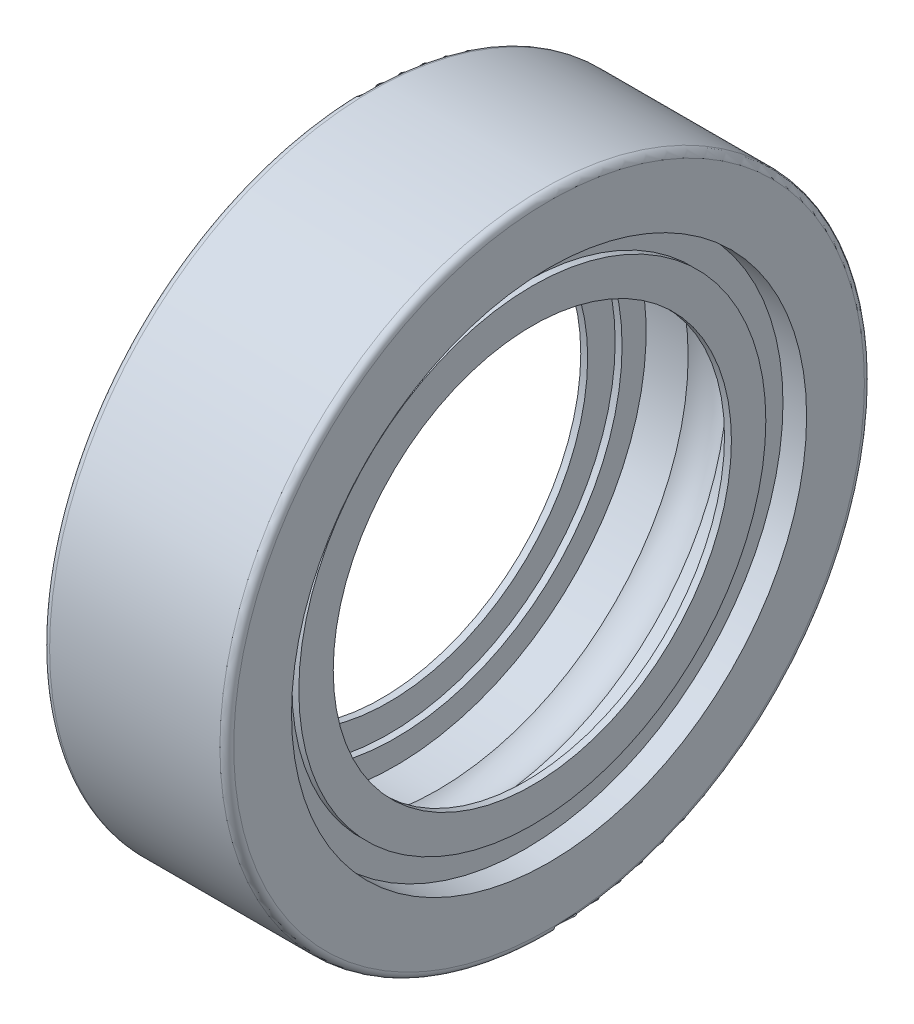
ISO-10303-21;
HEADER;
FILE_DESCRIPTION(('STEP AP214'),'2;1');
FILE_NAME('part.step','',(''),(''),'','','');
FILE_SCHEMA(('AUTOMOTIVE_DESIGN { 1 0 10303 214 1 1 1 1 }'));
ENDSEC;
DATA;
#1=APPLICATION_CONTEXT('core data for automotive mechanical design processes');
#2=APPLICATION_PROTOCOL_DEFINITION('international standard','automotive_design',2000,#1);
#3=PRODUCT_CONTEXT('',#1,'mechanical');
#4=PRODUCT('Part','Part','',(#3));
#5=PRODUCT_RELATED_PRODUCT_CATEGORY('part','',(#4));
#6=PRODUCT_DEFINITION_FORMATION('','',#4);
#7=PRODUCT_DEFINITION_CONTEXT('part definition',#1,'design');
#8=PRODUCT_DEFINITION('design','',#6,#7);
#9=PRODUCT_DEFINITION_SHAPE('','',#8);
#10=(LENGTH_UNIT() NAMED_UNIT(*) SI_UNIT(.MILLI.,.METRE.));
#11=(NAMED_UNIT(*) PLANE_ANGLE_UNIT() SI_UNIT($,.RADIAN.));
#12=(NAMED_UNIT(*) SI_UNIT($,.STERADIAN.) SOLID_ANGLE_UNIT());
#13=UNCERTAINTY_MEASURE_WITH_UNIT(LENGTH_MEASURE(1.E-05),#10,'distance_accuracy_value','');
#14=(GEOMETRIC_REPRESENTATION_CONTEXT(3) GLOBAL_UNCERTAINTY_ASSIGNED_CONTEXT((#13)) GLOBAL_UNIT_ASSIGNED_CONTEXT((#10,
#11,#12)) REPRESENTATION_CONTEXT('',''));
#15=CARTESIAN_POINT('',(0.,0.,0.));
#16=DIRECTION('',(0.,0.,1.));
#17=DIRECTION('',(1.,0.,0.));
#18=AXIS2_PLACEMENT_3D('',#15,#16,#17);
#19=CARTESIAN_POINT('',(3.9725,0.,9.2475));
#20=DIRECTION('',(-1.,0.,0.));
#21=DIRECTION('',(0.,0.,1.));
#22=AXIS2_PLACEMENT_3D('',#19,#20,#21);
#23=PLANE('',#22);
#24=CARTESIAN_POINT('',(3.9725,0.,0.));
#25=DIRECTION('',(1.,0.,0.));
#26=DIRECTION('',(0.,0.,-1.));
#27=AXIS2_PLACEMENT_3D('',#24,#25,#26);
#28=CIRCLE('',#27,8.65);
#29=CARTESIAN_POINT('',(3.9725,0.,-8.65));
#30=VERTEX_POINT('',#29);
#31=EDGE_CURVE('E203',#30,#30,#28,.T.);
#32=ORIENTED_EDGE('',*,*,#31,.T.);
#33=EDGE_LOOP('',(#32));
#34=FACE_BOUND('',#33,.T.);
#35=CARTESIAN_POINT('',(3.9725,0.,0.));
#36=DIRECTION('',(-1.,0.,0.));
#37=DIRECTION('',(0.,0.,-1.));
#38=AXIS2_PLACEMENT_3D('',#35,#36,#37);
#39=CIRCLE('',#38,9.845);
#40=CARTESIAN_POINT('',(3.9725,0.,-9.845));
#41=VERTEX_POINT('',#40);
#42=EDGE_CURVE('E11',#41,#41,#39,.T.);
#43=ORIENTED_EDGE('',*,*,#42,.T.);
#44=EDGE_LOOP('',(#43));
#45=FACE_BOUND('',#44,.T.);
#46=ADVANCED_FACE('F17',(#34,#45),#23,.T.);
#47=CARTESIAN_POINT('',(3.8225,0.,0.));
#48=DIRECTION('',(1.,0.,0.));
#49=DIRECTION('',(0.,0.,1.));
#50=AXIS2_PLACEMENT_3D('',#47,#48,#49);
#51=CYLINDRICAL_SURFACE('',#50,9.845);
#52=CARTESIAN_POINT('',(3.6725,0.,0.));
#53=DIRECTION('',(1.,0.,0.));
#54=DIRECTION('',(0.,0.,-1.));
#55=AXIS2_PLACEMENT_3D('',#52,#53,#54);
#56=CIRCLE('',#55,9.845);
#57=CARTESIAN_POINT('',(3.6725,0.,-9.845));
#58=VERTEX_POINT('',#57);
#59=EDGE_CURVE('E164',#58,#58,#56,.T.);
#60=ORIENTED_EDGE('',*,*,#59,.F.);
#61=DIRECTION('',(1.,0.,0.));
#62=VECTOR('',#61,1.);
#63=CARTESIAN_POINT('',(3.8225,0.,-9.845));
#64=LINE('',#63,#62);
#65=EDGE_CURVE('E28',#58,#41,#64,.T.);
#66=ORIENTED_EDGE('',*,*,#65,.T.);
#67=ORIENTED_EDGE('',*,*,#42,.F.);
#68=ORIENTED_EDGE('',*,*,#65,.F.);
#69=EDGE_LOOP('',(#60,#66,#67,#68));
#70=FACE_BOUND('',#69,.T.);
#71=ADVANCED_FACE('F643',(#70),#51,.F.);
#72=CARTESIAN_POINT('',(3.6725,0.,10.5175));
#73=DIRECTION('',(-1.,0.,0.));
#74=DIRECTION('',(0.,0.,1.));
#75=AXIS2_PLACEMENT_3D('',#72,#73,#74);
#76=PLANE('',#75);
#77=ORIENTED_EDGE('',*,*,#59,.T.);
#78=EDGE_LOOP('',(#77));
#79=FACE_BOUND('',#78,.T.);
#80=CARTESIAN_POINT('',(3.6725,0.,0.));
#81=DIRECTION('',(-1.,0.,0.));
#82=DIRECTION('',(0.,0.,1.));
#83=AXIS2_PLACEMENT_3D('',#80,#81,#82);
#84=CIRCLE('',#83,10.89);
#85=CARTESIAN_POINT('',(3.6725,0.,10.89));
#86=VERTEX_POINT('',#85);
#87=EDGE_CURVE('E159',#86,#86,#84,.T.);
#88=ORIENTED_EDGE('',*,*,#87,.T.);
#89=EDGE_LOOP('',(#88));
#90=FACE_BOUND('',#89,.T.);
#91=ADVANCED_FACE('F167',(#79,#90),#76,.T.);
#92=CARTESIAN_POINT('',(2.7596292626,0.,0.));
#93=DIRECTION('',(-1.,0.,0.));
#94=DIRECTION('',(0.,0.,-1.));
#95=AXIS2_PLACEMENT_3D('',#92,#93,#94);
#96=CYLINDRICAL_SURFACE('',#95,10.89);
#97=ORIENTED_EDGE('',*,*,#87,.F.);
#98=DIRECTION('',(-1.,0.,0.));
#99=VECTOR('',#98,1.);
#100=CARTESIAN_POINT('',(2.7596292626,0.,10.89));
#101=LINE('',#100,#99);
#102=CARTESIAN_POINT('',(1.846758525201,0.,10.89));
#103=VERTEX_POINT('',#102);
#104=EDGE_CURVE('E156',#86,#103,#101,.T.);
#105=ORIENTED_EDGE('',*,*,#104,.T.);
#106=CARTESIAN_POINT('',(1.846758525201,0.,0.));
#107=DIRECTION('',(1.,0.,0.));
#108=DIRECTION('',(0.,0.,1.));
#109=AXIS2_PLACEMENT_3D('',#106,#107,#108);
#110=CIRCLE('',#109,10.89);
#111=CARTESIAN_POINT('',(1.846758525201,0.,-10.89));
#112=VERTEX_POINT('',#111);
#113=EDGE_CURVE('E174',#112,#103,#110,.T.);
#114=ORIENTED_EDGE('',*,*,#113,.F.);
#115=CARTESIAN_POINT('',(1.846758525201,0.,0.));
#116=DIRECTION('',(1.,0.,0.));
#117=DIRECTION('',(0.,0.,1.));
#118=AXIS2_PLACEMENT_3D('',#115,#116,#117);
#119=CIRCLE('',#118,10.89);
#120=EDGE_CURVE('E161',#103,#112,#119,.T.);
#121=ORIENTED_EDGE('',*,*,#120,.F.);
#122=ORIENTED_EDGE('',*,*,#104,.F.);
#123=EDGE_LOOP('',(#97,#105,#114,#121,#122));
#124=FACE_BOUND('',#123,.T.);
#125=ADVANCED_FACE('F158',(#124),#96,.F.);
#126=CARTESIAN_POINT('',(1.,0.,0.));
#127=DIRECTION('',(1.,0.,0.));
#128=DIRECTION('',(0.,0.,1.));
#129=AXIS2_PLACEMENT_3D('',#126,#127,#128);
#130=TOROIDAL_SURFACE('',#129,9.845,1.345);
#131=CARTESIAN_POINT('',(0.1532414747993,0.,0.));
#132=DIRECTION('',(-1.,0.,0.));
#133=DIRECTION('',(0.,0.,1.));
#134=AXIS2_PLACEMENT_3D('',#131,#132,#133);
#135=CIRCLE('',#134,10.89);
#136=CARTESIAN_POINT('',(0.1532414747993,0.,10.89));
#137=VERTEX_POINT('',#136);
#138=CARTESIAN_POINT('',(0.1532414747993,0.,-10.89));
#139=VERTEX_POINT('',#138);
#140=EDGE_CURVE('E197',#137,#139,#135,.T.);
#141=ORIENTED_EDGE('',*,*,#140,.T.);
#142=CARTESIAN_POINT('',(1.,0.,-9.845));
#143=DIRECTION('',(0.,-1.,0.));
#144=DIRECTION('',(0.,0.,-1.));
#145=AXIS2_PLACEMENT_3D('',#142,#143,#144);
#146=CIRCLE('',#145,1.345);
#147=EDGE_CURVE('E204',#139,#112,#146,.T.);
#148=ORIENTED_EDGE('',*,*,#147,.T.);
#149=ORIENTED_EDGE('',*,*,#113,.T.);
#150=ORIENTED_EDGE('',*,*,#120,.T.);
#151=ORIENTED_EDGE('',*,*,#147,.F.);
#152=CARTESIAN_POINT('',(0.1532414747993,0.,0.));
#153=DIRECTION('',(-1.,0.,0.));
#154=DIRECTION('',(0.,0.,1.));
#155=AXIS2_PLACEMENT_3D('',#152,#153,#154);
#156=CIRCLE('',#155,10.89);
#157=EDGE_CURVE('E196',#139,#137,#156,.T.);
#158=ORIENTED_EDGE('',*,*,#157,.T.);
#159=EDGE_LOOP('',(#141,#148,#149,#150,#151,#158));
#160=FACE_BOUND('',#159,.T.);
#161=ADVANCED_FACE('F616',(#160),#130,.F.);
#162=CARTESIAN_POINT('',(-0.7596292626003,0.,0.));
#163=DIRECTION('',(-1.,0.,0.));
#164=DIRECTION('',(0.,0.,-1.));
#165=AXIS2_PLACEMENT_3D('',#162,#163,#164);
#166=CYLINDRICAL_SURFACE('',#165,10.89);
#167=ORIENTED_EDGE('',*,*,#140,.F.);
#168=DIRECTION('',(-1.,0.,0.));
#169=VECTOR('',#168,1.);
#170=CARTESIAN_POINT('',(-0.7596292626003,0.,10.89));
#171=LINE('',#170,#169);
#172=CARTESIAN_POINT('',(-1.6725,0.,10.89));
#173=VERTEX_POINT('',#172);
#174=EDGE_CURVE('E193',#137,#173,#171,.T.);
#175=ORIENTED_EDGE('',*,*,#174,.T.);
#176=CARTESIAN_POINT('',(-1.6725,0.,0.));
#177=DIRECTION('',(1.,0.,0.));
#178=DIRECTION('',(0.,0.,-1.));
#179=AXIS2_PLACEMENT_3D('',#176,#177,#178);
#180=CIRCLE('',#179,10.89);
#181=EDGE_CURVE('E389',#173,#173,#180,.T.);
#182=ORIENTED_EDGE('',*,*,#181,.F.);
#183=ORIENTED_EDGE('',*,*,#174,.F.);
#184=ORIENTED_EDGE('',*,*,#157,.F.);
#185=EDGE_LOOP('',(#167,#175,#182,#183,#184));
#186=FACE_BOUND('',#185,.T.);
#187=ADVANCED_FACE('F606',(#186),#166,.F.);
#188=CARTESIAN_POINT('',(-1.6725,0.,10.5175));
#189=DIRECTION('',(1.,0.,0.));
#190=DIRECTION('',(0.,1.,0.));
#191=AXIS2_PLACEMENT_3D('',#188,#189,#190);
#192=PLANE('',#191);
#193=CARTESIAN_POINT('',(-1.6725,0.,0.));
#194=DIRECTION('',(-1.,0.,0.));
#195=DIRECTION('',(0.,0.,-1.));
#196=AXIS2_PLACEMENT_3D('',#193,#194,#195);
#197=CIRCLE('',#196,9.845);
#198=CARTESIAN_POINT('',(-1.6725,0.,-9.845));
#199=VERTEX_POINT('',#198);
#200=EDGE_CURVE('E179',#199,#199,#197,.T.);
#201=ORIENTED_EDGE('',*,*,#200,.T.);
#202=EDGE_LOOP('',(#201));
#203=FACE_BOUND('',#202,.T.);
#204=ORIENTED_EDGE('',*,*,#181,.T.);
#205=EDGE_LOOP('',(#204));
#206=FACE_BOUND('',#205,.T.);
#207=ADVANCED_FACE('F19',(#203,#206),#192,.T.);
#208=CARTESIAN_POINT('',(-1.8225,0.,0.));
#209=DIRECTION('',(-1.,0.,0.));
#210=DIRECTION('',(0.,0.,1.));
#211=AXIS2_PLACEMENT_3D('',#208,#209,#210);
#212=CYLINDRICAL_SURFACE('',#211,9.845);
#213=ORIENTED_EDGE('',*,*,#200,.F.);
#214=DIRECTION('',(-1.,0.,0.));
#215=VECTOR('',#214,1.);
#216=CARTESIAN_POINT('',(-1.8225,0.,-9.845));
#217=LINE('',#216,#215);
#218=CARTESIAN_POINT('',(-1.9725,0.,-9.845));
#219=VERTEX_POINT('',#218);
#220=EDGE_CURVE('E183',#199,#219,#217,.T.);
#221=ORIENTED_EDGE('',*,*,#220,.T.);
#222=CARTESIAN_POINT('',(-1.9725,0.,0.));
#223=DIRECTION('',(1.,0.,0.));
#224=DIRECTION('',(0.,0.,1.));
#225=AXIS2_PLACEMENT_3D('',#222,#223,#224);
#226=CIRCLE('',#225,9.845);
#227=EDGE_CURVE('E184',#219,#219,#226,.T.);
#228=ORIENTED_EDGE('',*,*,#227,.F.);
#229=ORIENTED_EDGE('',*,*,#220,.F.);
#230=EDGE_LOOP('',(#213,#221,#228,#229));
#231=FACE_BOUND('',#230,.T.);
#232=ADVANCED_FACE('F588',(#231),#212,.F.);
#233=CARTESIAN_POINT('',(-1.9725,0.,9.2475));
#234=DIRECTION('',(1.,0.,0.));
#235=DIRECTION('',(0.,1.,0.));
#236=AXIS2_PLACEMENT_3D('',#233,#234,#235);
#237=PLANE('',#236);
#238=CARTESIAN_POINT('',(-1.9725,0.,0.));
#239=DIRECTION('',(-1.,0.,0.));
#240=DIRECTION('',(0.,0.,-1.));
#241=AXIS2_PLACEMENT_3D('',#238,#239,#240);
#242=CIRCLE('',#241,8.65);
#243=CARTESIAN_POINT('',(-1.9725,0.,-8.65));
#244=VERTEX_POINT('',#243);
#245=EDGE_CURVE('E21',#244,#244,#242,.T.);
#246=ORIENTED_EDGE('',*,*,#245,.T.);
#247=EDGE_LOOP('',(#246));
#248=FACE_BOUND('',#247,.T.);
#249=ORIENTED_EDGE('',*,*,#227,.T.);
#250=EDGE_LOOP('',(#249));
#251=FACE_BOUND('',#250,.T.);
#252=ADVANCED_FACE('F578',(#248,#251),#237,.T.);
#253=CARTESIAN_POINT('',(-2.1225,0.,0.));
#254=DIRECTION('',(-1.,0.,0.));
#255=DIRECTION('',(0.,0.,1.));
#256=AXIS2_PLACEMENT_3D('',#253,#254,#255);
#257=CYLINDRICAL_SURFACE('',#256,8.65);
#258=ORIENTED_EDGE('',*,*,#245,.F.);
#259=DIRECTION('',(-1.,0.,0.));
#260=VECTOR('',#259,1.);
#261=CARTESIAN_POINT('',(-2.1225,0.,-8.65));
#262=LINE('',#261,#260);
#263=CARTESIAN_POINT('',(-2.2725,0.,-8.65));
#264=VERTEX_POINT('',#263);
#265=EDGE_CURVE('E221',#244,#264,#262,.T.);
#266=ORIENTED_EDGE('',*,*,#265,.T.);
#267=CARTESIAN_POINT('',(-2.2725,0.,0.));
#268=DIRECTION('',(1.,0.,0.));
#269=DIRECTION('',(0.,0.,1.));
#270=AXIS2_PLACEMENT_3D('',#267,#268,#269);
#271=CIRCLE('',#270,8.65);
#272=EDGE_CURVE('E234',#264,#264,#271,.T.);
#273=ORIENTED_EDGE('',*,*,#272,.F.);
#274=ORIENTED_EDGE('',*,*,#265,.F.);
#275=EDGE_LOOP('',(#258,#266,#273,#274));
#276=FACE_BOUND('',#275,.T.);
#277=ADVANCED_FACE('F569',(#276),#257,.F.);
#278=CARTESIAN_POINT('',(-2.2725,0.,9.3975));
#279=DIRECTION('',(-1.,0.,0.));
#280=DIRECTION('',(0.,0.,1.));
#281=AXIS2_PLACEMENT_3D('',#278,#279,#280);
#282=PLANE('',#281);
#283=ORIENTED_EDGE('',*,*,#272,.T.);
#284=EDGE_LOOP('',(#283));
#285=FACE_BOUND('',#284,.T.);
#286=CARTESIAN_POINT('',(-2.2725,0.,0.));
#287=DIRECTION('',(-1.,0.,0.));
#288=DIRECTION('',(0.,0.,-1.));
#289=AXIS2_PLACEMENT_3D('',#286,#287,#288);
#290=CIRCLE('',#289,10.145);
#291=CARTESIAN_POINT('',(-2.2725,0.,-10.145));
#292=VERTEX_POINT('',#291);
#293=EDGE_CURVE('E245',#292,#292,#290,.T.);
#294=ORIENTED_EDGE('',*,*,#293,.T.);
#295=EDGE_LOOP('',(#294));
#296=FACE_BOUND('',#295,.T.);
#297=ADVANCED_FACE('F559',(#285,#296),#282,.T.);
#298=CARTESIAN_POINT('',(-2.1225,0.,0.));
#299=DIRECTION('',(-1.,0.,0.));
#300=DIRECTION('',(0.,0.,1.));
#301=AXIS2_PLACEMENT_3D('',#298,#299,#300);
#302=CYLINDRICAL_SURFACE('',#301,10.145);
#303=ORIENTED_EDGE('',*,*,#293,.F.);
#304=DIRECTION('',(1.,0.,0.));
#305=VECTOR('',#304,1.);
#306=CARTESIAN_POINT('',(-2.1225,0.,-10.145));
#307=LINE('',#306,#305);
#308=CARTESIAN_POINT('',(-1.9725,0.,-10.145));
#309=VERTEX_POINT('',#308);
#310=EDGE_CURVE('E239',#292,#309,#307,.T.);
#311=ORIENTED_EDGE('',*,*,#310,.T.);
#312=CARTESIAN_POINT('',(-1.9725,0.,0.));
#313=DIRECTION('',(1.,0.,0.));
#314=DIRECTION('',(0.,0.,1.));
#315=AXIS2_PLACEMENT_3D('',#312,#313,#314);
#316=CIRCLE('',#315,10.145);
#317=EDGE_CURVE('E339',#309,#309,#316,.T.);
#318=ORIENTED_EDGE('',*,*,#317,.F.);
#319=ORIENTED_EDGE('',*,*,#310,.F.);
#320=EDGE_LOOP('',(#303,#311,#318,#319));
#321=FACE_BOUND('',#320,.T.);
#322=ADVANCED_FACE('F548',(#321),#302,.T.);
#323=CARTESIAN_POINT('',(-1.9725,0.,10.6675));
#324=DIRECTION('',(-1.,0.,0.));
#325=DIRECTION('',(0.,0.,1.));
#326=AXIS2_PLACEMENT_3D('',#323,#324,#325);
#327=PLANE('',#326);
#328=ORIENTED_EDGE('',*,*,#317,.T.);
#329=EDGE_LOOP('',(#328));
#330=FACE_BOUND('',#329,.T.);
#331=CARTESIAN_POINT('',(-1.9725,0.,0.));
#332=DIRECTION('',(-1.,0.,0.));
#333=DIRECTION('',(0.,0.,1.));
#334=AXIS2_PLACEMENT_3D('',#331,#332,#333);
#335=CIRCLE('',#334,11.19);
#336=CARTESIAN_POINT('',(-1.9725,0.,11.19));
#337=VERTEX_POINT('',#336);
#338=EDGE_CURVE('E340',#337,#337,#335,.T.);
#339=ORIENTED_EDGE('',*,*,#338,.T.);
#340=EDGE_LOOP('',(#339));
#341=FACE_BOUND('',#340,.T.);
#342=ADVANCED_FACE('F537',(#330,#341),#327,.T.);
#343=CARTESIAN_POINT('',(-2.33625,0.,0.));
#344=DIRECTION('',(-1.,0.,0.));
#345=DIRECTION('',(0.,0.,-1.));
#346=AXIS2_PLACEMENT_3D('',#343,#344,#345);
#347=CYLINDRICAL_SURFACE('',#346,11.19);
#348=ORIENTED_EDGE('',*,*,#338,.F.);
#349=DIRECTION('',(-1.,0.,0.));
#350=VECTOR('',#349,1.);
#351=CARTESIAN_POINT('',(-2.33625,0.,11.19));
#352=LINE('',#351,#350);
#353=CARTESIAN_POINT('',(-3.,0.,11.19));
#354=VERTEX_POINT('',#353);
#355=EDGE_CURVE('E336',#337,#354,#352,.T.);
#356=ORIENTED_EDGE('',*,*,#355,.T.);
#357=CARTESIAN_POINT('',(-3.,0.,0.));
#358=DIRECTION('',(1.,0.,0.));
#359=DIRECTION('',(0.,0.,-1.));
#360=AXIS2_PLACEMENT_3D('',#357,#358,#359);
#361=CIRCLE('',#360,11.19);
#362=EDGE_CURVE('E351',#354,#354,#361,.T.);
#363=ORIENTED_EDGE('',*,*,#362,.F.);
#364=ORIENTED_EDGE('',*,*,#355,.F.);
#365=EDGE_LOOP('',(#348,#356,#363,#364));
#366=FACE_BOUND('',#365,.T.);
#367=ADVANCED_FACE('F525',(#366),#347,.F.);
#368=CARTESIAN_POINT('',(-3.,0.,-12.445));
#369=DIRECTION('',(-1.,0.,0.));
#370=DIRECTION('',(0.,0.,1.));
#371=AXIS2_PLACEMENT_3D('',#368,#369,#370);
#372=PLANE('',#371);
#373=ORIENTED_EDGE('',*,*,#362,.T.);
#374=EDGE_LOOP('',(#373));
#375=FACE_BOUND('',#374,.T.);
#376=CARTESIAN_POINT('',(-3.,0.,0.));
#377=DIRECTION('',(-1.,0.,0.));
#378=DIRECTION('',(0.,0.,-1.));
#379=AXIS2_PLACEMENT_3D('',#376,#377,#378);
#380=CIRCLE('',#379,13.7);
#381=CARTESIAN_POINT('',(-3.,0.,-13.7));
#382=VERTEX_POINT('',#381);
#383=EDGE_CURVE('E253',#382,#382,#380,.T.);
#384=ORIENTED_EDGE('',*,*,#383,.T.);
#385=EDGE_LOOP('',(#384));
#386=FACE_BOUND('',#385,.T.);
#387=ADVANCED_FACE('F513',(#375,#386),#372,.T.);
#388=CARTESIAN_POINT('',(-2.7,0.,0.));
#389=DIRECTION('',(1.,0.,0.));
#390=DIRECTION('',(0.,0.,1.));
#391=AXIS2_PLACEMENT_3D('',#388,#389,#390);
#392=TOROIDAL_SURFACE('',#391,13.7,0.3);
#393=CARTESIAN_POINT('',(-2.7,0.,0.));
#394=DIRECTION('',(-1.,0.,0.));
#395=DIRECTION('',(0.,0.,1.));
#396=AXIS2_PLACEMENT_3D('',#393,#394,#395);
#397=CIRCLE('',#396,14.);
#398=CARTESIAN_POINT('',(-2.7,0.,14.));
#399=VERTEX_POINT('',#398);
#400=CARTESIAN_POINT('',(-2.7,0.,-14.));
#401=VERTEX_POINT('',#400);
#402=EDGE_CURVE('E216',#399,#401,#397,.T.);
#403=ORIENTED_EDGE('',*,*,#402,.T.);
#404=CARTESIAN_POINT('',(-2.7,0.,-13.7));
#405=DIRECTION('',(0.,1.,0.));
#406=DIRECTION('',(0.,0.,-1.));
#407=AXIS2_PLACEMENT_3D('',#404,#405,#406);
#408=CIRCLE('',#407,0.3);
#409=EDGE_CURVE('E192',#401,#382,#408,.T.);
#410=ORIENTED_EDGE('',*,*,#409,.T.);
#411=ORIENTED_EDGE('',*,*,#383,.F.);
#412=ORIENTED_EDGE('',*,*,#409,.F.);
#413=CARTESIAN_POINT('',(-2.7,0.,0.));
#414=DIRECTION('',(-1.,0.,0.));
#415=DIRECTION('',(0.,0.,1.));
#416=AXIS2_PLACEMENT_3D('',#413,#414,#415);
#417=CIRCLE('',#416,14.);
#418=EDGE_CURVE('E189',#401,#399,#417,.T.);
#419=ORIENTED_EDGE('',*,*,#418,.T.);
#420=EDGE_LOOP('',(#403,#410,#411,#412,#419));
#421=FACE_BOUND('',#420,.T.);
#422=ADVANCED_FACE('F504',(#421),#392,.T.);
#423=CARTESIAN_POINT('',(1.,0.,0.));
#424=DIRECTION('',(-1.,0.,0.));
#425=DIRECTION('',(0.,0.,-1.));
#426=AXIS2_PLACEMENT_3D('',#423,#424,#425);
#427=CYLINDRICAL_SURFACE('',#426,14.);
#428=ORIENTED_EDGE('',*,*,#402,.F.);
#429=DIRECTION('',(1.,0.,0.));
#430=VECTOR('',#429,1.);
#431=CARTESIAN_POINT('',(1.,0.,14.));
#432=LINE('',#431,#430);
#433=CARTESIAN_POINT('',(4.7,0.,14.));
#434=VERTEX_POINT('',#433);
#435=EDGE_CURVE('E123',#399,#434,#432,.T.);
#436=ORIENTED_EDGE('',*,*,#435,.T.);
#437=CARTESIAN_POINT('',(4.7,0.,0.));
#438=DIRECTION('',(1.,0.,0.));
#439=DIRECTION('',(0.,0.,1.));
#440=AXIS2_PLACEMENT_3D('',#437,#438,#439);
#441=CIRCLE('',#440,14.);
#442=CARTESIAN_POINT('',(4.7,0.,-14.));
#443=VERTEX_POINT('',#442);
#444=EDGE_CURVE('E187',#443,#434,#441,.T.);
#445=ORIENTED_EDGE('',*,*,#444,.F.);
#446=CARTESIAN_POINT('',(4.7,0.,0.));
#447=DIRECTION('',(1.,0.,0.));
#448=DIRECTION('',(0.,0.,1.));
#449=AXIS2_PLACEMENT_3D('',#446,#447,#448);
#450=CIRCLE('',#449,14.);
#451=EDGE_CURVE('E132',#434,#443,#450,.T.);
#452=ORIENTED_EDGE('',*,*,#451,.F.);
#453=ORIENTED_EDGE('',*,*,#435,.F.);
#454=ORIENTED_EDGE('',*,*,#418,.F.);
#455=EDGE_LOOP('',(#428,#436,#445,#452,#453,#454));
#456=FACE_BOUND('',#455,.T.);
#457=ADVANCED_FACE('F495',(#456),#427,.T.);
#458=CARTESIAN_POINT('',(4.7,0.,0.));
#459=DIRECTION('',(1.,0.,0.));
#460=DIRECTION('',(0.,0.,1.));
#461=AXIS2_PLACEMENT_3D('',#458,#459,#460);
#462=TOROIDAL_SURFACE('',#461,13.7,0.3);
#463=CARTESIAN_POINT('',(5.,0.,0.));
#464=DIRECTION('',(1.,0.,0.));
#465=DIRECTION('',(0.,0.,-1.));
#466=AXIS2_PLACEMENT_3D('',#463,#464,#465);
#467=CIRCLE('',#466,13.7);
#468=CARTESIAN_POINT('',(5.,0.,-13.7));
#469=VERTEX_POINT('',#468);
#470=EDGE_CURVE('E188',#469,#469,#467,.T.);
#471=ORIENTED_EDGE('',*,*,#470,.F.);
#472=CARTESIAN_POINT('',(4.7,0.,-13.7));
#473=DIRECTION('',(0.,1.,0.));
#474=DIRECTION('',(0.,0.,-1.));
#475=AXIS2_PLACEMENT_3D('',#472,#473,#474);
#476=CIRCLE('',#475,0.3);
#477=EDGE_CURVE('E140',#469,#443,#476,.T.);
#478=ORIENTED_EDGE('',*,*,#477,.T.);
#479=ORIENTED_EDGE('',*,*,#444,.T.);
#480=ORIENTED_EDGE('',*,*,#451,.T.);
#481=ORIENTED_EDGE('',*,*,#477,.F.);
#482=EDGE_LOOP('',(#471,#478,#479,#480,#481));
#483=FACE_BOUND('',#482,.T.);
#484=ADVANCED_FACE('F482',(#483),#462,.T.);
#485=CARTESIAN_POINT('',(5.,0.,-12.445));
#486=DIRECTION('',(1.,0.,0.));
#487=DIRECTION('',(0.,1.,0.));
#488=AXIS2_PLACEMENT_3D('',#485,#486,#487);
#489=PLANE('',#488);
#490=CARTESIAN_POINT('',(5.,0.,0.));
#491=DIRECTION('',(-1.,0.,0.));
#492=DIRECTION('',(0.,0.,1.));
#493=AXIS2_PLACEMENT_3D('',#490,#491,#492);
#494=CIRCLE('',#493,11.19);
#495=CARTESIAN_POINT('',(5.,0.,11.19));
#496=VERTEX_POINT('',#495);
#497=EDGE_CURVE('E210',#496,#496,#494,.T.);
#498=ORIENTED_EDGE('',*,*,#497,.T.);
#499=EDGE_LOOP('',(#498));
#500=FACE_BOUND('',#499,.T.);
#501=ORIENTED_EDGE('',*,*,#470,.T.);
#502=EDGE_LOOP('',(#501));
#503=FACE_BOUND('',#502,.T.);
#504=ADVANCED_FACE('F471',(#500,#503),#489,.T.);
#505=CARTESIAN_POINT('',(4.33625,0.,0.));
#506=DIRECTION('',(-1.,0.,0.));
#507=DIRECTION('',(0.,0.,-1.));
#508=AXIS2_PLACEMENT_3D('',#505,#506,#507);
#509=CYLINDRICAL_SURFACE('',#508,11.19);
#510=ORIENTED_EDGE('',*,*,#497,.F.);
#511=DIRECTION('',(-1.,0.,0.));
#512=VECTOR('',#511,1.);
#513=CARTESIAN_POINT('',(4.33625,0.,11.19));
#514=LINE('',#513,#512);
#515=CARTESIAN_POINT('',(3.9725,0.,11.19));
#516=VERTEX_POINT('',#515);
#517=EDGE_CURVE('E214',#496,#516,#514,.T.);
#518=ORIENTED_EDGE('',*,*,#517,.T.);
#519=CARTESIAN_POINT('',(3.9725,0.,0.));
#520=DIRECTION('',(1.,0.,0.));
#521=DIRECTION('',(0.,0.,-1.));
#522=AXIS2_PLACEMENT_3D('',#519,#520,#521);
#523=CIRCLE('',#522,11.19);
#524=EDGE_CURVE('E215',#516,#516,#523,.T.);
#525=ORIENTED_EDGE('',*,*,#524,.F.);
#526=ORIENTED_EDGE('',*,*,#517,.F.);
#527=EDGE_LOOP('',(#510,#518,#525,#526));
#528=FACE_BOUND('',#527,.T.);
#529=ADVANCED_FACE('F459',(#528),#509,.F.);
#530=CARTESIAN_POINT('',(3.9725,0.,10.6675));
#531=DIRECTION('',(1.,0.,0.));
#532=DIRECTION('',(0.,1.,0.));
#533=AXIS2_PLACEMENT_3D('',#530,#531,#532);
#534=PLANE('',#533);
#535=CARTESIAN_POINT('',(3.9725,0.,0.));
#536=DIRECTION('',(-1.,0.,0.));
#537=DIRECTION('',(0.,0.,-1.));
#538=AXIS2_PLACEMENT_3D('',#535,#536,#537);
#539=CIRCLE('',#538,10.145);
#540=CARTESIAN_POINT('',(3.9725,0.,-10.145));
#541=VERTEX_POINT('',#540);
#542=EDGE_CURVE('E257',#541,#541,#539,.T.);
#543=ORIENTED_EDGE('',*,*,#542,.T.);
#544=EDGE_LOOP('',(#543));
#545=FACE_BOUND('',#544,.T.);
#546=ORIENTED_EDGE('',*,*,#524,.T.);
#547=EDGE_LOOP('',(#546));
#548=FACE_BOUND('',#547,.T.);
#549=ADVANCED_FACE('F446',(#545,#548),#534,.T.);
#550=CARTESIAN_POINT('',(4.1225,0.,0.));
#551=DIRECTION('',(1.,0.,0.));
#552=DIRECTION('',(0.,0.,1.));
#553=AXIS2_PLACEMENT_3D('',#550,#551,#552);
#554=CYLINDRICAL_SURFACE('',#553,10.145);
#555=CARTESIAN_POINT('',(4.2725,0.,0.));
#556=DIRECTION('',(1.,0.,0.));
#557=DIRECTION('',(0.,0.,-1.));
#558=AXIS2_PLACEMENT_3D('',#555,#556,#557);
#559=CIRCLE('',#558,10.145);
#560=CARTESIAN_POINT('',(4.2725,0.,-10.145));
#561=VERTEX_POINT('',#560);
#562=EDGE_CURVE('E258',#561,#561,#559,.T.);
#563=ORIENTED_EDGE('',*,*,#562,.F.);
#564=DIRECTION('',(-1.,0.,0.));
#565=VECTOR('',#564,1.);
#566=CARTESIAN_POINT('',(4.1225,0.,-10.145));
#567=LINE('',#566,#565);
#568=EDGE_CURVE('E261',#561,#541,#567,.T.);
#569=ORIENTED_EDGE('',*,*,#568,.T.);
#570=ORIENTED_EDGE('',*,*,#542,.F.);
#571=ORIENTED_EDGE('',*,*,#568,.F.);
#572=EDGE_LOOP('',(#563,#569,#570,#571));
#573=FACE_BOUND('',#572,.T.);
#574=ADVANCED_FACE('F433',(#573),#554,.T.);
#575=CARTESIAN_POINT('',(4.2725,0.,9.3975));
#576=DIRECTION('',(1.,0.,0.));
#577=DIRECTION('',(0.,1.,0.));
#578=AXIS2_PLACEMENT_3D('',#575,#576,#577);
#579=PLANE('',#578);
#580=CARTESIAN_POINT('',(4.2725,0.,0.));
#581=DIRECTION('',(-1.,0.,0.));
#582=DIRECTION('',(0.,0.,-1.));
#583=AXIS2_PLACEMENT_3D('',#580,#581,#582);
#584=CIRCLE('',#583,8.65);
#585=CARTESIAN_POINT('',(4.2725,0.,-8.65));
#586=VERTEX_POINT('',#585);
#587=EDGE_CURVE('E202',#586,#586,#584,.T.);
#588=ORIENTED_EDGE('',*,*,#587,.T.);
#589=EDGE_LOOP('',(#588));
#590=FACE_BOUND('',#589,.T.);
#591=ORIENTED_EDGE('',*,*,#562,.T.);
#592=EDGE_LOOP('',(#591));
#593=FACE_BOUND('',#592,.T.);
#594=ADVANCED_FACE('F419',(#590,#593),#579,.T.);
#595=CARTESIAN_POINT('',(4.1225,0.,0.));
#596=DIRECTION('',(1.,0.,0.));
#597=DIRECTION('',(0.,0.,1.));
#598=AXIS2_PLACEMENT_3D('',#595,#596,#597);
#599=CYLINDRICAL_SURFACE('',#598,8.65);
#600=ORIENTED_EDGE('',*,*,#31,.F.);
#601=DIRECTION('',(1.,0.,0.));
#602=VECTOR('',#601,1.);
#603=CARTESIAN_POINT('',(4.1225,0.,-8.65));
#604=LINE('',#603,#602);
#605=EDGE_CURVE('E198',#30,#586,#604,.T.);
#606=ORIENTED_EDGE('',*,*,#605,.T.);
#607=ORIENTED_EDGE('',*,*,#587,.F.);
#608=ORIENTED_EDGE('',*,*,#605,.F.);
#609=EDGE_LOOP('',(#600,#606,#607,#608));
#610=FACE_BOUND('',#609,.T.);
#611=ADVANCED_FACE('F413',(#610),#599,.F.);
#612=CLOSED_SHELL('',(#46,#71,#91,#125,#161,#187,#207,#232,#252,#277,#297,#322,#342,#367,#387,
#422,#457,#484,#504,#529,#549,#574,#594,#611));
#613=MANIFOLD_SOLID_BREP('B1',#612);
#614=ADVANCED_BREP_SHAPE_REPRESENTATION('',(#18,#613),#14);
#615=SHAPE_DEFINITION_REPRESENTATION(#9,#614);
ENDSEC;
END-ISO-10303-21;
